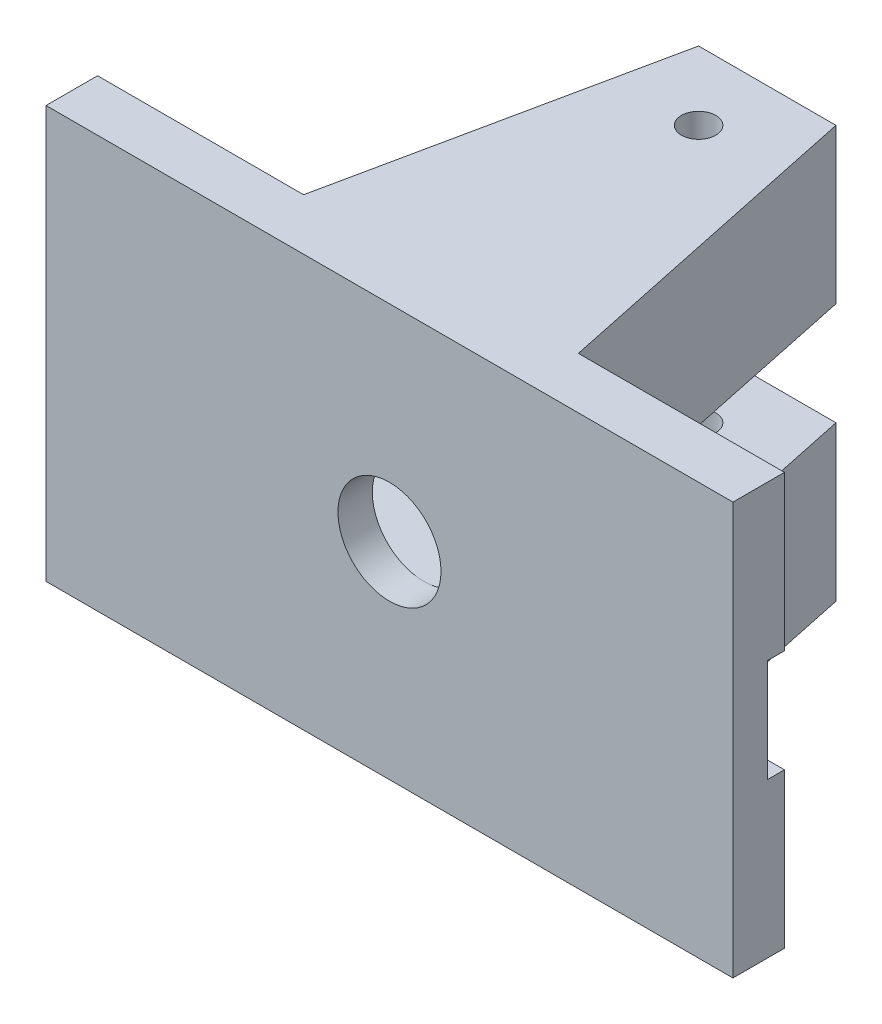
ISO-10303-21;
HEADER;
FILE_DESCRIPTION(('STEP AP214'),'2;1');
FILE_NAME('part.step','',(''),(''),'','','');
FILE_SCHEMA(('AUTOMOTIVE_DESIGN { 1 0 10303 214 1 1 1 1 }'));
ENDSEC;
DATA;
#1=APPLICATION_CONTEXT('core data for automotive mechanical design processes');
#2=APPLICATION_PROTOCOL_DEFINITION('international standard','automotive_design',2000,#1);
#3=PRODUCT_CONTEXT('',#1,'mechanical');
#4=PRODUCT('Part','Part','',(#3));
#5=PRODUCT_RELATED_PRODUCT_CATEGORY('part','',(#4));
#6=PRODUCT_DEFINITION_FORMATION('','',#4);
#7=PRODUCT_DEFINITION_CONTEXT('part definition',#1,'design');
#8=PRODUCT_DEFINITION('design','',#6,#7);
#9=PRODUCT_DEFINITION_SHAPE('','',#8);
#10=(LENGTH_UNIT() NAMED_UNIT(*) SI_UNIT(.MILLI.,.METRE.));
#11=(NAMED_UNIT(*) PLANE_ANGLE_UNIT() SI_UNIT($,.RADIAN.));
#12=(NAMED_UNIT(*) SI_UNIT($,.STERADIAN.) SOLID_ANGLE_UNIT());
#13=UNCERTAINTY_MEASURE_WITH_UNIT(LENGTH_MEASURE(1.E-05),#10,'distance_accuracy_value','');
#14=(GEOMETRIC_REPRESENTATION_CONTEXT(3) GLOBAL_UNCERTAINTY_ASSIGNED_CONTEXT((#13)) GLOBAL_UNIT_ASSIGNED_CONTEXT((#10,
#11,#12)) REPRESENTATION_CONTEXT('',''));
#15=CARTESIAN_POINT('',(0.,0.,0.));
#16=DIRECTION('',(0.,0.,1.));
#17=DIRECTION('',(1.,0.,0.));
#18=AXIS2_PLACEMENT_3D('',#15,#16,#17);
#19=CARTESIAN_POINT('',(-100.,60.,0.));
#20=DIRECTION('',(0.,0.,1.));
#21=DIRECTION('',(1.,0.,0.));
#22=AXIS2_PLACEMENT_3D('',#19,#20,#21);
#23=PLANE('',#22);
#24=DIRECTION('',(1.,0.,0.));
#25=VECTOR('',#24,1.);
#26=CARTESIAN_POINT('',(100.,-15.,0.));
#27=LINE('',#26,#25);
#28=CARTESIAN_POINT('',(-100.,-15.,0.));
#29=VERTEX_POINT('',#28);
#30=CARTESIAN_POINT('',(0.,-15.,0.));
#31=VERTEX_POINT('',#30);
#32=EDGE_CURVE('E257',#29,#31,#27,.T.);
#33=ORIENTED_EDGE('',*,*,#32,.F.);
#34=DIRECTION('',(0.,-1.,0.));
#35=VECTOR('',#34,1.);
#36=CARTESIAN_POINT('',(-100.,-60.,0.));
#37=LINE('',#36,#35);
#38=CARTESIAN_POINT('',(-100.,15.,0.));
#39=VERTEX_POINT('',#38);
#40=EDGE_CURVE('E317',#39,#29,#37,.T.);
#41=ORIENTED_EDGE('',*,*,#40,.F.);
#42=DIRECTION('',(-1.,0.,0.));
#43=VECTOR('',#42,1.);
#44=CARTESIAN_POINT('',(100.,15.,0.));
#45=LINE('',#44,#43);
#46=CARTESIAN_POINT('',(0.,15.,0.));
#47=VERTEX_POINT('',#46);
#48=EDGE_CURVE('E280',#47,#39,#45,.T.);
#49=ORIENTED_EDGE('',*,*,#48,.F.);
#50=CARTESIAN_POINT('',(0.,0.,0.));
#51=DIRECTION('',(0.,0.,1.));
#52=DIRECTION('',(1.,0.,0.));
#53=AXIS2_PLACEMENT_3D('',#50,#51,#52);
#54=CIRCLE('',#53,15.);
#55=EDGE_CURVE('E451',#47,#31,#54,.T.);
#56=ORIENTED_EDGE('',*,*,#55,.T.);
#57=EDGE_LOOP('',(#33,#41,#49,#56));
#58=FACE_BOUND('',#57,.T.);
#59=ADVANCED_FACE('F38',(#58),#23,.F.);
#60=CARTESIAN_POINT('',(100.,-15.,0.));
#61=VERTEX_POINT('',#60);
#62=EDGE_CURVE('E254',#31,#61,#27,.T.);
#63=ORIENTED_EDGE('',*,*,#62,.F.);
#64=EDGE_CURVE('E293',#31,#47,#54,.T.);
#65=ORIENTED_EDGE('',*,*,#64,.T.);
#66=CARTESIAN_POINT('',(100.,15.,0.));
#67=VERTEX_POINT('',#66);
#68=EDGE_CURVE('E267',#67,#47,#45,.T.);
#69=ORIENTED_EDGE('',*,*,#68,.F.);
#70=DIRECTION('',(0.,1.,0.));
#71=VECTOR('',#70,1.);
#72=CARTESIAN_POINT('',(100.,-60.,0.));
#73=LINE('',#72,#71);
#74=EDGE_CURVE('E289',#61,#67,#73,.T.);
#75=ORIENTED_EDGE('',*,*,#74,.F.);
#76=EDGE_LOOP('',(#63,#65,#69,#75));
#77=FACE_BOUND('',#76,.T.);
#78=ADVANCED_FACE('F372',(#77),#23,.F.);
#79=CARTESIAN_POINT('',(-100.,60.,10.));
#80=DIRECTION('',(0.,0.,1.));
#81=DIRECTION('',(1.,0.,0.));
#82=AXIS2_PLACEMENT_3D('',#79,#80,#81);
#83=PLANE('',#82);
#84=DIRECTION('',(0.,-1.,0.));
#85=VECTOR('',#84,1.);
#86=CARTESIAN_POINT('',(-100.,-60.,10.));
#87=LINE('',#86,#85);
#88=CARTESIAN_POINT('',(-100.,60.,10.));
#89=VERTEX_POINT('',#88);
#90=CARTESIAN_POINT('',(-100.,-60.,10.));
#91=VERTEX_POINT('',#90);
#92=EDGE_CURVE('E460',#89,#91,#87,.T.);
#93=ORIENTED_EDGE('',*,*,#92,.T.);
#94=DIRECTION('',(1.,0.,0.));
#95=VECTOR('',#94,1.);
#96=CARTESIAN_POINT('',(100.,-60.,10.));
#97=LINE('',#96,#95);
#98=CARTESIAN_POINT('',(100.,-60.,10.));
#99=VERTEX_POINT('',#98);
#100=EDGE_CURVE('E464',#91,#99,#97,.T.);
#101=ORIENTED_EDGE('',*,*,#100,.T.);
#102=DIRECTION('',(0.,1.,0.));
#103=VECTOR('',#102,1.);
#104=CARTESIAN_POINT('',(100.,-60.,10.));
#105=LINE('',#104,#103);
#106=CARTESIAN_POINT('',(100.,60.,10.));
#107=VERTEX_POINT('',#106);
#108=EDGE_CURVE('E340',#99,#107,#105,.T.);
#109=ORIENTED_EDGE('',*,*,#108,.T.);
#110=DIRECTION('',(-1.,0.,0.));
#111=VECTOR('',#110,1.);
#112=CARTESIAN_POINT('',(100.,60.,10.));
#113=LINE('',#112,#111);
#114=EDGE_CURVE('E322',#107,#89,#113,.T.);
#115=ORIENTED_EDGE('',*,*,#114,.T.);
#116=EDGE_LOOP('',(#93,#101,#109,#115));
#117=FACE_BOUND('',#116,.T.);
#118=CARTESIAN_POINT('',(0.,0.,10.));
#119=DIRECTION('',(0.,0.,1.));
#120=DIRECTION('',(1.,0.,0.));
#121=AXIS2_PLACEMENT_3D('',#118,#119,#120);
#122=CIRCLE('',#121,15.);
#123=CARTESIAN_POINT('',(15.,0.,10.));
#124=VERTEX_POINT('',#123);
#125=EDGE_CURVE('E276',#124,#124,#122,.T.);
#126=ORIENTED_EDGE('',*,*,#125,.F.);
#127=EDGE_LOOP('',(#126));
#128=FACE_BOUND('',#127,.T.);
#129=ADVANCED_FACE('F378',(#117,#128),#83,.T.);
#130=CARTESIAN_POINT('',(-100.,-60.,10.));
#131=DIRECTION('',(1.,0.,0.));
#132=DIRECTION('',(0.,0.,-1.));
#133=AXIS2_PLACEMENT_3D('',#130,#131,#132);
#134=PLANE('',#133);
#135=DIRECTION('',(0.,0.,-1.));
#136=VECTOR('',#135,1.);
#137=CARTESIAN_POINT('',(-100.,60.,10.));
#138=LINE('',#137,#136);
#139=CARTESIAN_POINT('',(-100.,60.,-5.));
#140=VERTEX_POINT('',#139);
#141=EDGE_CURVE('E326',#89,#140,#138,.T.);
#142=ORIENTED_EDGE('',*,*,#141,.T.);
#143=DIRECTION('',(0.,1.,0.));
#144=VECTOR('',#143,1.);
#145=CARTESIAN_POINT('',(-100.,-60.0000000000001,-5.));
#146=LINE('',#145,#144);
#147=CARTESIAN_POINT('',(-100.,15.,-5.));
#148=VERTEX_POINT('',#147);
#149=EDGE_CURVE('E235',#148,#140,#146,.T.);
#150=ORIENTED_EDGE('',*,*,#149,.F.);
#151=DIRECTION('',(0.,0.,1.));
#152=VECTOR('',#151,1.);
#153=CARTESIAN_POINT('',(-100.,15.,-100.));
#154=LINE('',#153,#152);
#155=EDGE_CURVE('E273',#148,#39,#154,.T.);
#156=ORIENTED_EDGE('',*,*,#155,.T.);
#157=ORIENTED_EDGE('',*,*,#40,.T.);
#158=DIRECTION('',(0.,0.,1.));
#159=VECTOR('',#158,1.);
#160=CARTESIAN_POINT('',(-100.,-15.,-100.));
#161=LINE('',#160,#159);
#162=CARTESIAN_POINT('',(-100.,-15.,-5.));
#163=VERTEX_POINT('',#162);
#164=EDGE_CURVE('E264',#163,#29,#161,.T.);
#165=ORIENTED_EDGE('',*,*,#164,.F.);
#166=CARTESIAN_POINT('',(-100.,-60.0000000000001,-5.));
#167=VERTEX_POINT('',#166);
#168=EDGE_CURVE('E231',#167,#163,#146,.T.);
#169=ORIENTED_EDGE('',*,*,#168,.F.);
#170=DIRECTION('',(0.,0.,-1.));
#171=VECTOR('',#170,1.);
#172=CARTESIAN_POINT('',(-100.,-60.,10.));
#173=LINE('',#172,#171);
#174=EDGE_CURVE('E303',#91,#167,#173,.T.);
#175=ORIENTED_EDGE('',*,*,#174,.F.);
#176=ORIENTED_EDGE('',*,*,#92,.F.);
#177=EDGE_LOOP('',(#142,#150,#156,#157,#165,#169,#175,#176));
#178=FACE_BOUND('',#177,.T.);
#179=ADVANCED_FACE('F40',(#178),#134,.F.);
#180=CARTESIAN_POINT('',(100.,-60.,10.));
#181=DIRECTION('',(0.,1.,0.));
#182=DIRECTION('',(-1.,0.,0.));
#183=AXIS2_PLACEMENT_3D('',#180,#181,#182);
#184=PLANE('',#183);
#185=CARTESIAN_POINT('',(0.,-60.,-80.));
#186=DIRECTION('',(0.,1.,0.));
#187=DIRECTION('',(-1.,0.,0.));
#188=AXIS2_PLACEMENT_3D('',#185,#186,#187);
#189=CIRCLE('',#188,5.00000000000001);
#190=CARTESIAN_POINT('',(-5.,-60.,-80.));
#191=VERTEX_POINT('',#190);
#192=EDGE_CURVE('E397',#191,#191,#189,.T.);
#193=ORIENTED_EDGE('',*,*,#192,.T.);
#194=EDGE_LOOP('',(#193));
#195=FACE_BOUND('',#194,.T.);
#196=DIRECTION('',(0.206010481049842,0.,0.978549784986749));
#197=VECTOR('',#196,1.);
#198=CARTESIAN_POINT('',(40.0000000000001,-60.,-5.00000000000001));
#199=LINE('',#198,#197);
#200=CARTESIAN_POINT('',(20.,-60.,-100.));
#201=VERTEX_POINT('',#200);
#202=CARTESIAN_POINT('',(40.0000000000001,-60.,-5.00000000000001));
#203=VERTEX_POINT('',#202);
#204=EDGE_CURVE('E64',#201,#203,#199,.T.);
#205=ORIENTED_EDGE('',*,*,#204,.T.);
#206=DIRECTION('',(1.,0.,0.));
#207=VECTOR('',#206,1.);
#208=CARTESIAN_POINT('',(100.,-60.,-5.00000000000003));
#209=LINE('',#208,#207);
#210=CARTESIAN_POINT('',(100.,-60.,-5.00000000000003));
#211=VERTEX_POINT('',#210);
#212=EDGE_CURVE('E183',#203,#211,#209,.T.);
#213=ORIENTED_EDGE('',*,*,#212,.T.);
#214=DIRECTION('',(0.,0.,-1.));
#215=VECTOR('',#214,1.);
#216=CARTESIAN_POINT('',(100.,-60.,10.));
#217=LINE('',#216,#215);
#218=EDGE_CURVE('E310',#99,#211,#217,.T.);
#219=ORIENTED_EDGE('',*,*,#218,.F.);
#220=ORIENTED_EDGE('',*,*,#100,.F.);
#221=ORIENTED_EDGE('',*,*,#174,.T.);
#222=DIRECTION('',(1.,0.,0.));
#223=VECTOR('',#222,1.);
#224=CARTESIAN_POINT('',(-100.,-60.0000000000001,-5.));
#225=LINE('',#224,#223);
#226=CARTESIAN_POINT('',(-40.,-60.,-5.));
#227=VERTEX_POINT('',#226);
#228=EDGE_CURVE('E219',#167,#227,#225,.T.);
#229=ORIENTED_EDGE('',*,*,#228,.T.);
#230=DIRECTION('',(0.206010481049842,0.,-0.978549784986749));
#231=VECTOR('',#230,1.);
#232=CARTESIAN_POINT('',(-40.,-60.,-5.));
#233=LINE('',#232,#231);
#234=CARTESIAN_POINT('',(-20.,-60.,-100.));
#235=VERTEX_POINT('',#234);
#236=EDGE_CURVE('E223',#227,#235,#233,.T.);
#237=ORIENTED_EDGE('',*,*,#236,.T.);
#238=DIRECTION('',(-1.,0.,0.));
#239=VECTOR('',#238,1.);
#240=CARTESIAN_POINT('',(100.,-60.,-100.));
#241=LINE('',#240,#239);
#242=EDGE_CURVE('E196',#201,#235,#241,.T.);
#243=ORIENTED_EDGE('',*,*,#242,.F.);
#244=EDGE_LOOP('',(#205,#213,#219,#220,#221,#229,#237,#243));
#245=FACE_BOUND('',#244,.T.);
#246=ADVANCED_FACE('F194',(#195,#245),#184,.F.);
#247=CARTESIAN_POINT('',(100.,-60.,10.));
#248=DIRECTION('',(-1.,0.,0.));
#249=DIRECTION('',(0.,0.,1.));
#250=AXIS2_PLACEMENT_3D('',#247,#248,#249);
#251=PLANE('',#250);
#252=ORIENTED_EDGE('',*,*,#218,.T.);
#253=DIRECTION('',(0.,1.,0.));
#254=VECTOR('',#253,1.);
#255=CARTESIAN_POINT('',(100.,-60.,-5.00000000000003));
#256=LINE('',#255,#254);
#257=CARTESIAN_POINT('',(100.,-15.,-5.00000000000003));
#258=VERTEX_POINT('',#257);
#259=EDGE_CURVE('E186',#211,#258,#256,.T.);
#260=ORIENTED_EDGE('',*,*,#259,.T.);
#261=DIRECTION('',(0.,0.,1.));
#262=VECTOR('',#261,1.);
#263=CARTESIAN_POINT('',(100.,-15.,-100.));
#264=LINE('',#263,#262);
#265=EDGE_CURVE('E260',#258,#61,#264,.T.);
#266=ORIENTED_EDGE('',*,*,#265,.T.);
#267=ORIENTED_EDGE('',*,*,#74,.T.);
#268=DIRECTION('',(0.,0.,1.));
#269=VECTOR('',#268,1.);
#270=CARTESIAN_POINT('',(100.,15.,-100.));
#271=LINE('',#270,#269);
#272=CARTESIAN_POINT('',(100.,15.,-5.00000000000003));
#273=VERTEX_POINT('',#272);
#274=EDGE_CURVE('E292',#273,#67,#271,.T.);
#275=ORIENTED_EDGE('',*,*,#274,.F.);
#276=CARTESIAN_POINT('',(100.,60.,-5.00000000000003));
#277=VERTEX_POINT('',#276);
#278=EDGE_CURVE('E179',#273,#277,#256,.T.);
#279=ORIENTED_EDGE('',*,*,#278,.T.);
#280=DIRECTION('',(0.,0.,-1.));
#281=VECTOR('',#280,1.);
#282=CARTESIAN_POINT('',(100.,60.,10.));
#283=LINE('',#282,#281);
#284=EDGE_CURVE('E314',#107,#277,#283,.T.);
#285=ORIENTED_EDGE('',*,*,#284,.F.);
#286=ORIENTED_EDGE('',*,*,#108,.F.);
#287=EDGE_LOOP('',(#252,#260,#266,#267,#275,#279,#285,#286));
#288=FACE_BOUND('',#287,.T.);
#289=ADVANCED_FACE('F339',(#288),#251,.F.);
#290=CARTESIAN_POINT('',(100.,60.,10.));
#291=DIRECTION('',(0.,-1.,0.));
#292=DIRECTION('',(1.,0.,0.));
#293=AXIS2_PLACEMENT_3D('',#290,#291,#292);
#294=PLANE('',#293);
#295=CARTESIAN_POINT('',(0.,60.,-80.));
#296=DIRECTION('',(0.,1.,0.));
#297=DIRECTION('',(-1.,0.,0.));
#298=AXIS2_PLACEMENT_3D('',#295,#296,#297);
#299=CIRCLE('',#298,5.00000000000001);
#300=CARTESIAN_POINT('',(-5.00000000000002,60.,-80.));
#301=VERTEX_POINT('',#300);
#302=EDGE_CURVE('E398',#301,#301,#299,.T.);
#303=ORIENTED_EDGE('',*,*,#302,.F.);
#304=EDGE_LOOP('',(#303));
#305=FACE_BOUND('',#304,.T.);
#306=ORIENTED_EDGE('',*,*,#284,.T.);
#307=DIRECTION('',(1.,0.,0.));
#308=VECTOR('',#307,1.);
#309=CARTESIAN_POINT('',(100.,60.,-5.00000000000003));
#310=LINE('',#309,#308);
#311=CARTESIAN_POINT('',(40.,60.,-5.00000000000001));
#312=VERTEX_POINT('',#311);
#313=EDGE_CURVE('E198',#312,#277,#310,.T.);
#314=ORIENTED_EDGE('',*,*,#313,.F.);
#315=DIRECTION('',(0.206010481049842,0.,0.978549784986749));
#316=VECTOR('',#315,1.);
#317=CARTESIAN_POINT('',(40.,60.,-5.00000000000001));
#318=LINE('',#317,#316);
#319=CARTESIAN_POINT('',(20.,60.,-100.));
#320=VERTEX_POINT('',#319);
#321=EDGE_CURVE('E200',#320,#312,#318,.T.);
#322=ORIENTED_EDGE('',*,*,#321,.F.);
#323=DIRECTION('',(1.,0.,0.));
#324=VECTOR('',#323,1.);
#325=CARTESIAN_POINT('',(100.,60.,-100.));
#326=LINE('',#325,#324);
#327=CARTESIAN_POINT('',(-20.,60.,-100.));
#328=VERTEX_POINT('',#327);
#329=EDGE_CURVE('E270',#328,#320,#326,.T.);
#330=ORIENTED_EDGE('',*,*,#329,.F.);
#331=DIRECTION('',(0.206010481049842,0.,-0.978549784986749));
#332=VECTOR('',#331,1.);
#333=CARTESIAN_POINT('',(-40.,60.,-5.));
#334=LINE('',#333,#332);
#335=CARTESIAN_POINT('',(-40.,60.,-5.));
#336=VERTEX_POINT('',#335);
#337=EDGE_CURVE('E224',#336,#328,#334,.T.);
#338=ORIENTED_EDGE('',*,*,#337,.F.);
#339=DIRECTION('',(1.,0.,0.));
#340=VECTOR('',#339,1.);
#341=CARTESIAN_POINT('',(-100.,60.,-5.));
#342=LINE('',#341,#340);
#343=EDGE_CURVE('E218',#140,#336,#342,.T.);
#344=ORIENTED_EDGE('',*,*,#343,.F.);
#345=ORIENTED_EDGE('',*,*,#141,.F.);
#346=ORIENTED_EDGE('',*,*,#114,.F.);
#347=EDGE_LOOP('',(#306,#314,#322,#330,#338,#344,#345,#346));
#348=FACE_BOUND('',#347,.T.);
#349=ADVANCED_FACE('F333',(#305,#348),#294,.F.);
#350=CARTESIAN_POINT('',(0.,0.,10.));
#351=DIRECTION('',(0.,0.,-1.));
#352=DIRECTION('',(-1.,0.,0.));
#353=AXIS2_PLACEMENT_3D('',#350,#351,#352);
#354=CYLINDRICAL_SURFACE('',#353,15.);
#355=ORIENTED_EDGE('',*,*,#125,.T.);
#356=EDGE_LOOP('',(#355));
#357=FACE_BOUND('',#356,.T.);
#358=ORIENTED_EDGE('',*,*,#55,.F.);
#359=ORIENTED_EDGE('',*,*,#64,.F.);
#360=EDGE_LOOP('',(#358,#359));
#361=FACE_BOUND('',#360,.T.);
#362=ADVANCED_FACE('F386',(#357,#361),#354,.F.);
#363=CARTESIAN_POINT('',(100.,15.,-100.));
#364=DIRECTION('',(0.,1.,0.));
#365=DIRECTION('',(0.,0.,1.));
#366=AXIS2_PLACEMENT_3D('',#363,#364,#365);
#367=PLANE('',#366);
#368=CARTESIAN_POINT('',(0.,15.,-80.));
#369=DIRECTION('',(0.,1.,0.));
#370=DIRECTION('',(0.,0.,1.));
#371=AXIS2_PLACEMENT_3D('',#368,#369,#370);
#372=CIRCLE('',#371,5.00000000000001);
#373=CARTESIAN_POINT('',(0.,15.,-75.));
#374=VERTEX_POINT('',#373);
#375=EDGE_CURVE('E203',#374,#374,#372,.T.);
#376=ORIENTED_EDGE('',*,*,#375,.T.);
#377=EDGE_LOOP('',(#376));
#378=FACE_BOUND('',#377,.T.);
#379=DIRECTION('',(0.206010481049842,0.,0.978549784986749));
#380=VECTOR('',#379,1.);
#381=CARTESIAN_POINT('',(23.395225464191,15.,-83.8726790450928));
#382=LINE('',#381,#380);
#383=CARTESIAN_POINT('',(20.,15.,-100.));
#384=VERTEX_POINT('',#383);
#385=CARTESIAN_POINT('',(40.,15.,-5.00000000000001));
#386=VERTEX_POINT('',#385);
#387=EDGE_CURVE('E56',#384,#386,#382,.T.);
#388=ORIENTED_EDGE('',*,*,#387,.T.);
#389=DIRECTION('',(1.,0.,0.));
#390=VECTOR('',#389,1.);
#391=CARTESIAN_POINT('',(100.,15.,-5.00000000000003));
#392=LINE('',#391,#390);
#393=EDGE_CURVE('E215',#386,#273,#392,.T.);
#394=ORIENTED_EDGE('',*,*,#393,.T.);
#395=ORIENTED_EDGE('',*,*,#274,.T.);
#396=ORIENTED_EDGE('',*,*,#68,.T.);
#397=ORIENTED_EDGE('',*,*,#48,.T.);
#398=ORIENTED_EDGE('',*,*,#155,.F.);
#399=DIRECTION('',(1.,0.,0.));
#400=VECTOR('',#399,1.);
#401=CARTESIAN_POINT('',(100.,15.,-5.));
#402=LINE('',#401,#400);
#403=CARTESIAN_POINT('',(-40.,15.,-5.));
#404=VERTEX_POINT('',#403);
#405=EDGE_CURVE('E250',#148,#404,#402,.T.);
#406=ORIENTED_EDGE('',*,*,#405,.T.);
#407=DIRECTION('',(0.206010481049842,0.,-0.978549784986749));
#408=VECTOR('',#407,1.);
#409=CARTESIAN_POINT('',(-14.9071618037135,15.,-124.190981432361));
#410=LINE('',#409,#408);
#411=CARTESIAN_POINT('',(-20.,15.,-100.));
#412=VERTEX_POINT('',#411);
#413=EDGE_CURVE('E247',#404,#412,#410,.T.);
#414=ORIENTED_EDGE('',*,*,#413,.T.);
#415=DIRECTION('',(-1.,0.,0.));
#416=VECTOR('',#415,1.);
#417=CARTESIAN_POINT('',(100.,15.,-100.));
#418=LINE('',#417,#416);
#419=EDGE_CURVE('E268',#384,#412,#418,.T.);
#420=ORIENTED_EDGE('',*,*,#419,.F.);
#421=EDGE_LOOP('',(#388,#394,#395,#396,#397,#398,#406,#414,#420));
#422=FACE_BOUND('',#421,.T.);
#423=ADVANCED_FACE('F345',(#378,#422),#367,.F.);
#424=CARTESIAN_POINT('',(100.,15.,-100.));
#425=DIRECTION('',(0.,0.,-1.));
#426=DIRECTION('',(-1.,0.,0.));
#427=AXIS2_PLACEMENT_3D('',#424,#425,#426);
#428=PLANE('',#427);
#429=DIRECTION('',(0.,1.,0.));
#430=VECTOR('',#429,1.);
#431=CARTESIAN_POINT('',(20.,-60.,-100.));
#432=LINE('',#431,#430);
#433=EDGE_CURVE('E191',#384,#320,#432,.T.);
#434=ORIENTED_EDGE('',*,*,#433,.F.);
#435=ORIENTED_EDGE('',*,*,#419,.T.);
#436=DIRECTION('',(0.,1.,0.));
#437=VECTOR('',#436,1.);
#438=CARTESIAN_POINT('',(-20.,-60.,-100.));
#439=LINE('',#438,#437);
#440=EDGE_CURVE('E239',#412,#328,#439,.T.);
#441=ORIENTED_EDGE('',*,*,#440,.T.);
#442=ORIENTED_EDGE('',*,*,#329,.T.);
#443=EDGE_LOOP('',(#434,#435,#441,#442));
#444=FACE_BOUND('',#443,.T.);
#445=ADVANCED_FACE('F350',(#444),#428,.T.);
#446=CARTESIAN_POINT('',(100.,-15.,-100.));
#447=DIRECTION('',(0.,-1.,0.));
#448=DIRECTION('',(0.,0.,-1.));
#449=AXIS2_PLACEMENT_3D('',#446,#447,#448);
#450=PLANE('',#449);
#451=CARTESIAN_POINT('',(0.,-15.,-80.));
#452=DIRECTION('',(0.,-1.,0.));
#453=DIRECTION('',(0.,0.,-1.));
#454=AXIS2_PLACEMENT_3D('',#451,#452,#453);
#455=CIRCLE('',#454,5.00000000000001);
#456=CARTESIAN_POINT('',(0.,-15.,-85.));
#457=VERTEX_POINT('',#456);
#458=EDGE_CURVE('E42',#457,#457,#455,.T.);
#459=ORIENTED_EDGE('',*,*,#458,.T.);
#460=EDGE_LOOP('',(#459));
#461=FACE_BOUND('',#460,.T.);
#462=ORIENTED_EDGE('',*,*,#265,.F.);
#463=DIRECTION('',(-1.,0.,0.));
#464=VECTOR('',#463,1.);
#465=CARTESIAN_POINT('',(100.,-15.,-5.00000000000003));
#466=LINE('',#465,#464);
#467=CARTESIAN_POINT('',(40.,-15.,-5.00000000000001));
#468=VERTEX_POINT('',#467);
#469=EDGE_CURVE('E11',#258,#468,#466,.T.);
#470=ORIENTED_EDGE('',*,*,#469,.T.);
#471=DIRECTION('',(-0.206010481049842,0.,-0.978549784986749));
#472=VECTOR('',#471,1.);
#473=CARTESIAN_POINT('',(23.395225464191,-15.,-83.8726790450928));
#474=LINE('',#473,#472);
#475=CARTESIAN_POINT('',(20.,-15.,-100.));
#476=VERTEX_POINT('',#475);
#477=EDGE_CURVE('E176',#468,#476,#474,.T.);
#478=ORIENTED_EDGE('',*,*,#477,.T.);
#479=DIRECTION('',(1.,0.,0.));
#480=VECTOR('',#479,1.);
#481=CARTESIAN_POINT('',(100.,-15.,-100.));
#482=LINE('',#481,#480);
#483=CARTESIAN_POINT('',(-20.,-15.,-100.));
#484=VERTEX_POINT('',#483);
#485=EDGE_CURVE('E256',#484,#476,#482,.T.);
#486=ORIENTED_EDGE('',*,*,#485,.F.);
#487=DIRECTION('',(-0.206010481049842,0.,0.978549784986749));
#488=VECTOR('',#487,1.);
#489=CARTESIAN_POINT('',(-14.9071618037135,-15.,-124.190981432361));
#490=LINE('',#489,#488);
#491=CARTESIAN_POINT('',(-40.,-15.,-5.));
#492=VERTEX_POINT('',#491);
#493=EDGE_CURVE('E234',#484,#492,#490,.T.);
#494=ORIENTED_EDGE('',*,*,#493,.T.);
#495=DIRECTION('',(-1.,0.,0.));
#496=VECTOR('',#495,1.);
#497=CARTESIAN_POINT('',(100.,-15.,-5.));
#498=LINE('',#497,#496);
#499=EDGE_CURVE('E48',#492,#163,#498,.T.);
#500=ORIENTED_EDGE('',*,*,#499,.T.);
#501=ORIENTED_EDGE('',*,*,#164,.T.);
#502=ORIENTED_EDGE('',*,*,#32,.T.);
#503=ORIENTED_EDGE('',*,*,#62,.T.);
#504=EDGE_LOOP('',(#462,#470,#478,#486,#494,#500,#501,#502,#503));
#505=FACE_BOUND('',#504,.T.);
#506=ADVANCED_FACE('F415',(#461,#505),#450,.F.);
#507=CARTESIAN_POINT('',(-100.,-60.,-100.));
#508=DIRECTION('',(0.,0.,-1.));
#509=DIRECTION('',(-1.,0.,0.));
#510=AXIS2_PLACEMENT_3D('',#507,#508,#509);
#511=PLANE('',#510);
#512=EDGE_CURVE('E210',#201,#476,#432,.T.);
#513=ORIENTED_EDGE('',*,*,#512,.F.);
#514=ORIENTED_EDGE('',*,*,#242,.T.);
#515=EDGE_CURVE('E236',#235,#484,#439,.T.);
#516=ORIENTED_EDGE('',*,*,#515,.T.);
#517=ORIENTED_EDGE('',*,*,#485,.T.);
#518=EDGE_LOOP('',(#513,#514,#516,#517));
#519=FACE_BOUND('',#518,.T.);
#520=ADVANCED_FACE('F421',(#519),#511,.T.);
#521=CARTESIAN_POINT('',(-40.,-60.,-5.));
#522=DIRECTION('',(0.978549784986749,0.,0.206010481049842));
#523=DIRECTION('',(0.206010481049842,0.,-0.978549784986749));
#524=AXIS2_PLACEMENT_3D('',#521,#522,#523);
#525=PLANE('',#524);
#526=ORIENTED_EDGE('',*,*,#515,.F.);
#527=ORIENTED_EDGE('',*,*,#236,.F.);
#528=DIRECTION('',(0.,1.,0.));
#529=VECTOR('',#528,1.);
#530=CARTESIAN_POINT('',(-40.,-60.,-5.));
#531=LINE('',#530,#529);
#532=EDGE_CURVE('E240',#227,#492,#531,.T.);
#533=ORIENTED_EDGE('',*,*,#532,.T.);
#534=ORIENTED_EDGE('',*,*,#493,.F.);
#535=EDGE_LOOP('',(#526,#527,#533,#534));
#536=FACE_BOUND('',#535,.T.);
#537=ADVANCED_FACE('F425',(#536),#525,.F.);
#538=CARTESIAN_POINT('',(-100.,-60.0000000000001,-5.));
#539=DIRECTION('',(0.,0.,1.));
#540=DIRECTION('',(1.,0.,0.));
#541=AXIS2_PLACEMENT_3D('',#538,#539,#540);
#542=PLANE('',#541);
#543=ORIENTED_EDGE('',*,*,#532,.F.);
#544=ORIENTED_EDGE('',*,*,#228,.F.);
#545=ORIENTED_EDGE('',*,*,#168,.T.);
#546=ORIENTED_EDGE('',*,*,#499,.F.);
#547=EDGE_LOOP('',(#543,#544,#545,#546));
#548=FACE_BOUND('',#547,.T.);
#549=ADVANCED_FACE('F429',(#548),#542,.F.);
#550=ORIENTED_EDGE('',*,*,#149,.T.);
#551=ORIENTED_EDGE('',*,*,#343,.T.);
#552=EDGE_CURVE('E227',#404,#336,#531,.T.);
#553=ORIENTED_EDGE('',*,*,#552,.F.);
#554=ORIENTED_EDGE('',*,*,#405,.F.);
#555=EDGE_LOOP('',(#550,#551,#553,#554));
#556=FACE_BOUND('',#555,.T.);
#557=ADVANCED_FACE('F427',(#556),#542,.F.);
#558=ORIENTED_EDGE('',*,*,#552,.T.);
#559=ORIENTED_EDGE('',*,*,#337,.T.);
#560=ORIENTED_EDGE('',*,*,#440,.F.);
#561=ORIENTED_EDGE('',*,*,#413,.F.);
#562=EDGE_LOOP('',(#558,#559,#560,#561));
#563=FACE_BOUND('',#562,.T.);
#564=ADVANCED_FACE('F353',(#563),#525,.F.);
#565=CARTESIAN_POINT('',(40.0000000000001,-60.,-5.00000000000001));
#566=DIRECTION('',(-0.978549784986749,0.,0.206010481049842));
#567=DIRECTION('',(0.206010481049842,0.,0.978549784986749));
#568=AXIS2_PLACEMENT_3D('',#565,#566,#567);
#569=PLANE('',#568);
#570=DIRECTION('',(0.,1.,0.));
#571=VECTOR('',#570,1.);
#572=CARTESIAN_POINT('',(40.0000000000001,-60.,-5.00000000000001));
#573=LINE('',#572,#571);
#574=EDGE_CURVE('E172',#203,#468,#573,.T.);
#575=ORIENTED_EDGE('',*,*,#574,.F.);
#576=ORIENTED_EDGE('',*,*,#204,.F.);
#577=ORIENTED_EDGE('',*,*,#512,.T.);
#578=ORIENTED_EDGE('',*,*,#477,.F.);
#579=EDGE_LOOP('',(#575,#576,#577,#578));
#580=FACE_BOUND('',#579,.T.);
#581=ADVANCED_FACE('F174',(#580),#569,.F.);
#582=CARTESIAN_POINT('',(100.,-60.,-5.00000000000003));
#583=DIRECTION('',(0.,0.,1.));
#584=DIRECTION('',(1.,0.,0.));
#585=AXIS2_PLACEMENT_3D('',#582,#583,#584);
#586=PLANE('',#585);
#587=ORIENTED_EDGE('',*,*,#259,.F.);
#588=ORIENTED_EDGE('',*,*,#212,.F.);
#589=ORIENTED_EDGE('',*,*,#574,.T.);
#590=ORIENTED_EDGE('',*,*,#469,.F.);
#591=EDGE_LOOP('',(#587,#588,#589,#590));
#592=FACE_BOUND('',#591,.T.);
#593=ADVANCED_FACE('F184',(#592),#586,.F.);
#594=EDGE_CURVE('E180',#386,#312,#573,.T.);
#595=ORIENTED_EDGE('',*,*,#594,.T.);
#596=ORIENTED_EDGE('',*,*,#313,.T.);
#597=ORIENTED_EDGE('',*,*,#278,.F.);
#598=ORIENTED_EDGE('',*,*,#393,.F.);
#599=EDGE_LOOP('',(#595,#596,#597,#598));
#600=FACE_BOUND('',#599,.T.);
#601=ADVANCED_FACE('F344',(#600),#586,.F.);
#602=ORIENTED_EDGE('',*,*,#433,.T.);
#603=ORIENTED_EDGE('',*,*,#321,.T.);
#604=ORIENTED_EDGE('',*,*,#594,.F.);
#605=ORIENTED_EDGE('',*,*,#387,.F.);
#606=EDGE_LOOP('',(#602,#603,#604,#605));
#607=FACE_BOUND('',#606,.T.);
#608=ADVANCED_FACE('F357',(#607),#569,.F.);
#609=CARTESIAN_POINT('',(0.,-60.,-80.));
#610=DIRECTION('',(0.,1.,0.));
#611=DIRECTION('',(-1.,0.,0.));
#612=AXIS2_PLACEMENT_3D('',#609,#610,#611);
#613=CYLINDRICAL_SURFACE('',#612,5.00000000000001);
#614=ORIENTED_EDGE('',*,*,#192,.F.);
#615=EDGE_LOOP('',(#614));
#616=FACE_BOUND('',#615,.T.);
#617=ORIENTED_EDGE('',*,*,#458,.F.);
#618=EDGE_LOOP('',(#617));
#619=FACE_BOUND('',#618,.T.);
#620=ADVANCED_FACE('F359',(#616,#619),#613,.F.);
#621=ORIENTED_EDGE('',*,*,#302,.T.);
#622=EDGE_LOOP('',(#621));
#623=FACE_BOUND('',#622,.T.);
#624=ORIENTED_EDGE('',*,*,#375,.F.);
#625=EDGE_LOOP('',(#624));
#626=FACE_BOUND('',#625,.T.);
#627=ADVANCED_FACE('F365',(#623,#626),#613,.F.);
#628=CLOSED_SHELL('',(#59,#78,#129,#179,#246,#289,#349,#362,#423,#445,#506,#520,#537,#549,#557,
#564,#581,#593,#601,#608,#620,#627));
#629=MANIFOLD_SOLID_BREP('B2',#628);
#630=ADVANCED_BREP_SHAPE_REPRESENTATION('',(#18,#629),#14);
#631=SHAPE_DEFINITION_REPRESENTATION(#9,#630);
ENDSEC;
END-ISO-10303-21;
